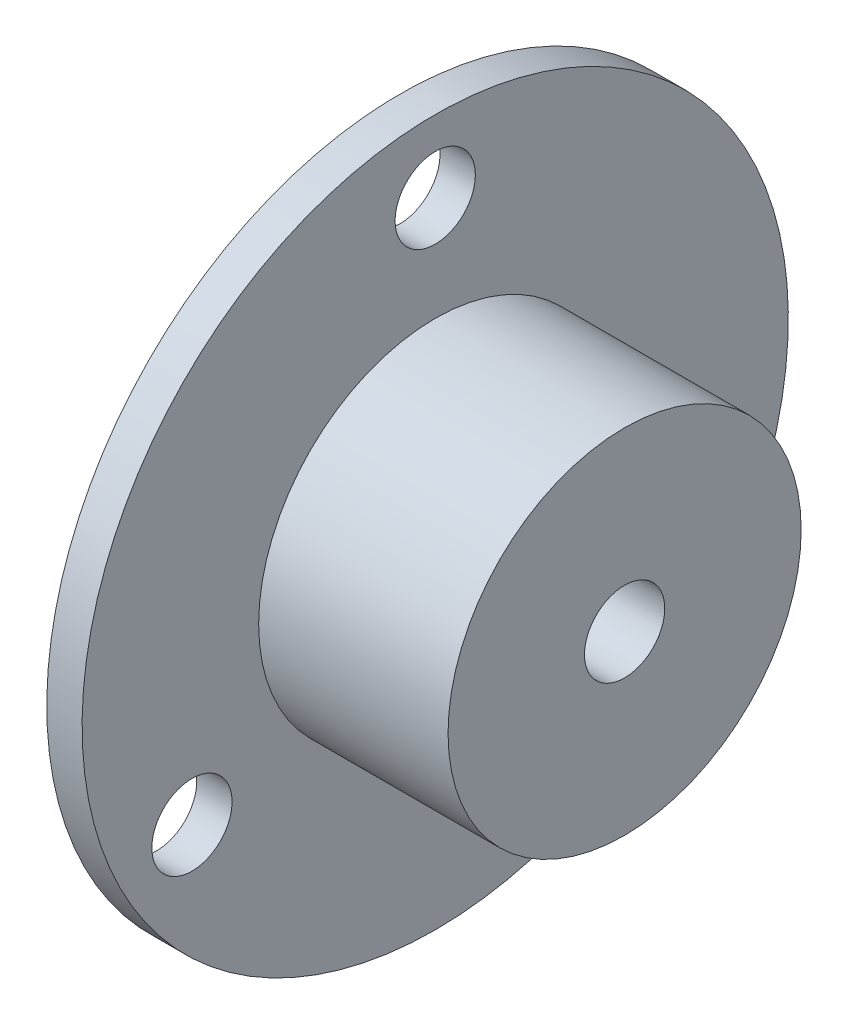
ISO-10303-21;
HEADER;
FILE_DESCRIPTION(('STEP AP214'),'2;1');
FILE_NAME('part.step','',(''),(''),'','','');
FILE_SCHEMA(('AUTOMOTIVE_DESIGN { 1 0 10303 214 1 1 1 1 }'));
ENDSEC;
DATA;
#1=APPLICATION_CONTEXT('core data for automotive mechanical design processes');
#2=APPLICATION_PROTOCOL_DEFINITION('international standard','automotive_design',2000,#1);
#3=PRODUCT_CONTEXT('',#1,'mechanical');
#4=PRODUCT('Part','Part','',(#3));
#5=PRODUCT_RELATED_PRODUCT_CATEGORY('part','',(#4));
#6=PRODUCT_DEFINITION_FORMATION('','',#4);
#7=PRODUCT_DEFINITION_CONTEXT('part definition',#1,'design');
#8=PRODUCT_DEFINITION('design','',#6,#7);
#9=PRODUCT_DEFINITION_SHAPE('','',#8);
#10=(LENGTH_UNIT() NAMED_UNIT(*) SI_UNIT(.MILLI.,.METRE.));
#11=(NAMED_UNIT(*) PLANE_ANGLE_UNIT() SI_UNIT($,.RADIAN.));
#12=(NAMED_UNIT(*) SI_UNIT($,.STERADIAN.) SOLID_ANGLE_UNIT());
#13=UNCERTAINTY_MEASURE_WITH_UNIT(LENGTH_MEASURE(1.E-05),#10,'distance_accuracy_value','');
#14=(GEOMETRIC_REPRESENTATION_CONTEXT(3) GLOBAL_UNCERTAINTY_ASSIGNED_CONTEXT((#13)) GLOBAL_UNIT_ASSIGNED_CONTEXT((#10,
#11,#12)) REPRESENTATION_CONTEXT('',''));
#15=CARTESIAN_POINT('',(0.,0.,0.));
#16=DIRECTION('',(0.,0.,1.));
#17=DIRECTION('',(1.,0.,0.));
#18=AXIS2_PLACEMENT_3D('',#15,#16,#17);
#19=CARTESIAN_POINT('',(-10.,-4.5,0.));
#20=DIRECTION('',(-1.,0.,0.));
#21=DIRECTION('',(0.,-1.,0.));
#22=AXIS2_PLACEMENT_3D('',#19,#20,#21);
#23=PLANE('',#22);
#24=CARTESIAN_POINT('',(-10.,0.,0.));
#25=DIRECTION('',(-1.,0.,0.));
#26=DIRECTION('',(0.,0.,1.));
#27=AXIS2_PLACEMENT_3D('',#24,#25,#26);
#28=CIRCLE('',#27,2.5);
#29=CARTESIAN_POINT('',(-10.,0.,2.5));
#30=VERTEX_POINT('',#29);
#31=EDGE_CURVE('E88',#30,#30,#28,.T.);
#32=ORIENTED_EDGE('',*,*,#31,.F.);
#33=EDGE_LOOP('',(#32));
#34=FACE_BOUND('',#33,.T.);
#35=CARTESIAN_POINT('',(-10.,0.,0.));
#36=DIRECTION('',(-1.,0.,0.));
#37=DIRECTION('',(0.,-1.,0.));
#38=AXIS2_PLACEMENT_3D('',#35,#36,#37);
#39=CIRCLE('',#38,4.5);
#40=CARTESIAN_POINT('',(-10.,-4.5,0.));
#41=VERTEX_POINT('',#40);
#42=EDGE_CURVE('E66',#41,#41,#39,.T.);
#43=ORIENTED_EDGE('',*,*,#42,.T.);
#44=EDGE_LOOP('',(#43));
#45=FACE_BOUND('',#44,.T.);
#46=ADVANCED_FACE('F38',(#34,#45),#23,.T.);
#47=CARTESIAN_POINT('',(14.,0.,0.));
#48=DIRECTION('',(1.,0.,0.));
#49=DIRECTION('',(0.,1.,0.));
#50=AXIS2_PLACEMENT_3D('',#47,#48,#49);
#51=PLANE('',#50);
#52=CARTESIAN_POINT('',(14.,0.,0.));
#53=DIRECTION('',(-1.,0.,0.));
#54=DIRECTION('',(0.,0.,1.));
#55=AXIS2_PLACEMENT_3D('',#52,#53,#54);
#56=CIRCLE('',#55,2.5);
#57=CARTESIAN_POINT('',(14.,0.,2.5));
#58=VERTEX_POINT('',#57);
#59=EDGE_CURVE('E83',#58,#58,#56,.T.);
#60=ORIENTED_EDGE('',*,*,#59,.T.);
#61=EDGE_LOOP('',(#60));
#62=FACE_BOUND('',#61,.T.);
#63=CARTESIAN_POINT('',(14.,0.,0.));
#64=DIRECTION('',(-1.,0.,0.));
#65=DIRECTION('',(0.,-1.,0.));
#66=AXIS2_PLACEMENT_3D('',#63,#64,#65);
#67=CIRCLE('',#66,11.);
#68=CARTESIAN_POINT('',(14.,-11.,0.));
#69=VERTEX_POINT('',#68);
#70=EDGE_CURVE('E10',#69,#69,#67,.T.);
#71=ORIENTED_EDGE('',*,*,#70,.F.);
#72=EDGE_LOOP('',(#71));
#73=FACE_BOUND('',#72,.T.);
#74=ADVANCED_FACE('F94',(#62,#73),#51,.T.);
#75=CARTESIAN_POINT('',(-10.,0.,0.));
#76=DIRECTION('',(-1.,0.,0.));
#77=DIRECTION('',(0.,-1.,0.));
#78=AXIS2_PLACEMENT_3D('',#75,#76,#77);
#79=CYLINDRICAL_SURFACE('',#78,11.);
#80=ORIENTED_EDGE('',*,*,#70,.T.);
#81=EDGE_LOOP('',(#80));
#82=FACE_BOUND('',#81,.T.);
#83=CARTESIAN_POINT('',(2.2,0.,0.));
#84=DIRECTION('',(-1.,0.,0.));
#85=DIRECTION('',(0.,-1.,0.));
#86=AXIS2_PLACEMENT_3D('',#83,#84,#85);
#87=CIRCLE('',#86,11.);
#88=CARTESIAN_POINT('',(2.2,-11.,0.));
#89=VERTEX_POINT('',#88);
#90=EDGE_CURVE('E44',#89,#89,#87,.T.);
#91=ORIENTED_EDGE('',*,*,#90,.F.);
#92=EDGE_LOOP('',(#91));
#93=FACE_BOUND('',#92,.T.);
#94=ADVANCED_FACE('F140',(#82,#93),#79,.T.);
#95=CARTESIAN_POINT('',(2.2,-11.,0.));
#96=DIRECTION('',(1.,0.,0.));
#97=DIRECTION('',(0.,1.,0.));
#98=AXIS2_PLACEMENT_3D('',#95,#96,#97);
#99=PLANE('',#98);
#100=CARTESIAN_POINT('',(2.2,17.5,0.));
#101=DIRECTION('',(1.,0.,0.));
#102=DIRECTION('',(0.,1.,0.));
#103=AXIS2_PLACEMENT_3D('',#100,#101,#102);
#104=CIRCLE('',#103,2.5);
#105=CARTESIAN_POINT('',(2.2,20.,0.));
#106=VERTEX_POINT('',#105);
#107=EDGE_CURVE('E69',#106,#106,#104,.T.);
#108=ORIENTED_EDGE('',*,*,#107,.F.);
#109=EDGE_LOOP('',(#108));
#110=FACE_BOUND('',#109,.T.);
#111=CARTESIAN_POINT('',(2.2,-8.74999999999936,15.1554445662288));
#112=DIRECTION('',(1.,0.,0.));
#113=DIRECTION('',(0.,1.,0.));
#114=AXIS2_PLACEMENT_3D('',#111,#112,#113);
#115=CIRCLE('',#114,2.50000000000096);
#116=CARTESIAN_POINT('',(2.2,-6.24999999999839,15.1554445662288));
#117=VERTEX_POINT('',#116);
#118=EDGE_CURVE('E72',#117,#117,#115,.T.);
#119=ORIENTED_EDGE('',*,*,#118,.F.);
#120=EDGE_LOOP('',(#119));
#121=FACE_BOUND('',#120,.T.);
#122=CARTESIAN_POINT('',(2.2,-8.75000000000064,-15.1554445662266));
#123=DIRECTION('',(1.,0.,0.));
#124=DIRECTION('',(0.,1.,0.));
#125=AXIS2_PLACEMENT_3D('',#122,#123,#124);
#126=CIRCLE('',#125,2.5000000000014);
#127=CARTESIAN_POINT('',(2.2,-6.24999999999924,-15.1554445662266));
#128=VERTEX_POINT('',#127);
#129=EDGE_CURVE('E75',#128,#128,#126,.T.);
#130=ORIENTED_EDGE('',*,*,#129,.F.);
#131=EDGE_LOOP('',(#130));
#132=FACE_BOUND('',#131,.T.);
#133=ORIENTED_EDGE('',*,*,#90,.T.);
#134=EDGE_LOOP('',(#133));
#135=FACE_BOUND('',#134,.T.);
#136=CARTESIAN_POINT('',(2.2,0.,0.));
#137=DIRECTION('',(-1.,0.,0.));
#138=DIRECTION('',(0.,-1.,0.));
#139=AXIS2_PLACEMENT_3D('',#136,#137,#138);
#140=CIRCLE('',#139,22.);
#141=CARTESIAN_POINT('',(2.2,-22.,0.));
#142=VERTEX_POINT('',#141);
#143=EDGE_CURVE('E48',#142,#142,#140,.T.);
#144=ORIENTED_EDGE('',*,*,#143,.F.);
#145=EDGE_LOOP('',(#144));
#146=FACE_BOUND('',#145,.T.);
#147=ADVANCED_FACE('F137',(#110,#121,#132,#135,#146),#99,.T.);
#148=CARTESIAN_POINT('',(-10.,0.,0.));
#149=DIRECTION('',(-1.,0.,0.));
#150=DIRECTION('',(0.,-1.,0.));
#151=AXIS2_PLACEMENT_3D('',#148,#149,#150);
#152=CYLINDRICAL_SURFACE('',#151,22.);
#153=ORIENTED_EDGE('',*,*,#143,.T.);
#154=EDGE_LOOP('',(#153));
#155=FACE_BOUND('',#154,.T.);
#156=CARTESIAN_POINT('',(0.,0.,0.));
#157=DIRECTION('',(-1.,0.,0.));
#158=DIRECTION('',(0.,-1.,0.));
#159=AXIS2_PLACEMENT_3D('',#156,#157,#158);
#160=CIRCLE('',#159,22.);
#161=CARTESIAN_POINT('',(0.,-22.,0.));
#162=VERTEX_POINT('',#161);
#163=EDGE_CURVE('E52',#162,#162,#160,.T.);
#164=ORIENTED_EDGE('',*,*,#163,.F.);
#165=EDGE_LOOP('',(#164));
#166=FACE_BOUND('',#165,.T.);
#167=ADVANCED_FACE('F133',(#155,#166),#152,.T.);
#168=CARTESIAN_POINT('',(0.,-22.,0.));
#169=DIRECTION('',(-1.,0.,0.));
#170=DIRECTION('',(0.,-1.,0.));
#171=AXIS2_PLACEMENT_3D('',#168,#169,#170);
#172=PLANE('',#171);
#173=CARTESIAN_POINT('',(0.,17.5,0.));
#174=DIRECTION('',(-1.,0.,0.));
#175=DIRECTION('',(0.,0.,1.));
#176=AXIS2_PLACEMENT_3D('',#173,#174,#175);
#177=CIRCLE('',#176,2.5);
#178=CARTESIAN_POINT('',(0.,17.5,2.5));
#179=VERTEX_POINT('',#178);
#180=EDGE_CURVE('E78',#179,#179,#177,.T.);
#181=ORIENTED_EDGE('',*,*,#180,.F.);
#182=EDGE_LOOP('',(#181));
#183=FACE_BOUND('',#182,.T.);
#184=CARTESIAN_POINT('',(0.,-8.74999999999936,15.1554445662288));
#185=DIRECTION('',(-1.,0.,0.));
#186=DIRECTION('',(0.,0.,1.));
#187=AXIS2_PLACEMENT_3D('',#184,#185,#186);
#188=CIRCLE('',#187,2.50000000000096);
#189=CARTESIAN_POINT('',(0.,-8.74999999999936,17.6554445662298));
#190=VERTEX_POINT('',#189);
#191=EDGE_CURVE('E82',#190,#190,#188,.T.);
#192=ORIENTED_EDGE('',*,*,#191,.F.);
#193=EDGE_LOOP('',(#192));
#194=FACE_BOUND('',#193,.T.);
#195=CARTESIAN_POINT('',(0.,-8.75000000000064,-15.1554445662266));
#196=DIRECTION('',(-1.,0.,0.));
#197=DIRECTION('',(0.,0.,1.));
#198=AXIS2_PLACEMENT_3D('',#195,#196,#197);
#199=CIRCLE('',#198,2.5000000000014);
#200=CARTESIAN_POINT('',(0.,-8.75000000000064,-12.6554445662252));
#201=VERTEX_POINT('',#200);
#202=EDGE_CURVE('E79',#201,#201,#199,.T.);
#203=ORIENTED_EDGE('',*,*,#202,.F.);
#204=EDGE_LOOP('',(#203));
#205=FACE_BOUND('',#204,.T.);
#206=ORIENTED_EDGE('',*,*,#163,.T.);
#207=EDGE_LOOP('',(#206));
#208=FACE_BOUND('',#207,.T.);
#209=CARTESIAN_POINT('',(0.,0.,0.));
#210=DIRECTION('',(-1.,0.,0.));
#211=DIRECTION('',(0.,-1.,0.));
#212=AXIS2_PLACEMENT_3D('',#209,#210,#211);
#213=CIRCLE('',#212,11.);
#214=CARTESIAN_POINT('',(0.,-11.,0.));
#215=VERTEX_POINT('',#214);
#216=EDGE_CURVE('E57',#215,#215,#213,.T.);
#217=ORIENTED_EDGE('',*,*,#216,.F.);
#218=EDGE_LOOP('',(#217));
#219=FACE_BOUND('',#218,.T.);
#220=ADVANCED_FACE('F129',(#183,#194,#205,#208,#219),#172,.T.);
#221=CARTESIAN_POINT('',(-10.,0.,0.));
#222=DIRECTION('',(-1.,0.,0.));
#223=DIRECTION('',(0.,-1.,0.));
#224=AXIS2_PLACEMENT_3D('',#221,#222,#223);
#225=CYLINDRICAL_SURFACE('',#224,11.);
#226=ORIENTED_EDGE('',*,*,#216,.T.);
#227=EDGE_LOOP('',(#226));
#228=FACE_BOUND('',#227,.T.);
#229=CARTESIAN_POINT('',(-5.,0.,0.));
#230=DIRECTION('',(-1.,0.,0.));
#231=DIRECTION('',(0.,-1.,0.));
#232=AXIS2_PLACEMENT_3D('',#229,#230,#231);
#233=CIRCLE('',#232,11.);
#234=CARTESIAN_POINT('',(-5.,-11.,0.));
#235=VERTEX_POINT('',#234);
#236=EDGE_CURVE('E60',#235,#235,#233,.T.);
#237=ORIENTED_EDGE('',*,*,#236,.F.);
#238=EDGE_LOOP('',(#237));
#239=FACE_BOUND('',#238,.T.);
#240=ADVANCED_FACE('F122',(#228,#239),#225,.T.);
#241=CARTESIAN_POINT('',(-5.,-11.,0.));
#242=DIRECTION('',(-1.,0.,0.));
#243=DIRECTION('',(0.,-1.,0.));
#244=AXIS2_PLACEMENT_3D('',#241,#242,#243);
#245=PLANE('',#244);
#246=ORIENTED_EDGE('',*,*,#236,.T.);
#247=EDGE_LOOP('',(#246));
#248=FACE_BOUND('',#247,.T.);
#249=CARTESIAN_POINT('',(-5.,0.,0.));
#250=DIRECTION('',(-1.,0.,0.));
#251=DIRECTION('',(0.,-1.,0.));
#252=AXIS2_PLACEMENT_3D('',#249,#250,#251);
#253=CIRCLE('',#252,4.5);
#254=CARTESIAN_POINT('',(-5.,-4.5,0.));
#255=VERTEX_POINT('',#254);
#256=EDGE_CURVE('E63',#255,#255,#253,.T.);
#257=ORIENTED_EDGE('',*,*,#256,.F.);
#258=EDGE_LOOP('',(#257));
#259=FACE_BOUND('',#258,.T.);
#260=ADVANCED_FACE('F111',(#248,#259),#245,.T.);
#261=CARTESIAN_POINT('',(-10.,0.,0.));
#262=DIRECTION('',(-1.,0.,0.));
#263=DIRECTION('',(0.,-1.,0.));
#264=AXIS2_PLACEMENT_3D('',#261,#262,#263);
#265=CYLINDRICAL_SURFACE('',#264,4.5);
#266=ORIENTED_EDGE('',*,*,#256,.T.);
#267=EDGE_LOOP('',(#266));
#268=FACE_BOUND('',#267,.T.);
#269=ORIENTED_EDGE('',*,*,#42,.F.);
#270=EDGE_LOOP('',(#269));
#271=FACE_BOUND('',#270,.T.);
#272=ADVANCED_FACE('F108',(#268,#271),#265,.T.);
#273=CARTESIAN_POINT('',(10.,-8.75000000000064,-15.1554445662266));
#274=DIRECTION('',(-1.,0.,0.));
#275=DIRECTION('',(0.,0.,1.));
#276=AXIS2_PLACEMENT_3D('',#273,#274,#275);
#277=CYLINDRICAL_SURFACE('',#276,2.5000000000014);
#278=ORIENTED_EDGE('',*,*,#129,.T.);
#279=EDGE_LOOP('',(#278));
#280=FACE_BOUND('',#279,.T.);
#281=ORIENTED_EDGE('',*,*,#202,.T.);
#282=EDGE_LOOP('',(#281));
#283=FACE_BOUND('',#282,.T.);
#284=ADVANCED_FACE('F110',(#280,#283),#277,.F.);
#285=CARTESIAN_POINT('',(10.,-8.74999999999936,15.1554445662288));
#286=DIRECTION('',(-1.,0.,0.));
#287=DIRECTION('',(0.,0.,1.));
#288=AXIS2_PLACEMENT_3D('',#285,#286,#287);
#289=CYLINDRICAL_SURFACE('',#288,2.50000000000096);
#290=ORIENTED_EDGE('',*,*,#118,.T.);
#291=EDGE_LOOP('',(#290));
#292=FACE_BOUND('',#291,.T.);
#293=ORIENTED_EDGE('',*,*,#191,.T.);
#294=EDGE_LOOP('',(#293));
#295=FACE_BOUND('',#294,.T.);
#296=ADVANCED_FACE('F119',(#292,#295),#289,.F.);
#297=CARTESIAN_POINT('',(10.,17.5,0.));
#298=DIRECTION('',(-1.,0.,0.));
#299=DIRECTION('',(0.,0.,1.));
#300=AXIS2_PLACEMENT_3D('',#297,#298,#299);
#301=CYLINDRICAL_SURFACE('',#300,2.5);
#302=ORIENTED_EDGE('',*,*,#107,.T.);
#303=EDGE_LOOP('',(#302));
#304=FACE_BOUND('',#303,.T.);
#305=ORIENTED_EDGE('',*,*,#180,.T.);
#306=EDGE_LOOP('',(#305));
#307=FACE_BOUND('',#306,.T.);
#308=ADVANCED_FACE('F100',(#304,#307),#301,.F.);
#309=CARTESIAN_POINT('',(14.,0.,0.));
#310=DIRECTION('',(-1.,0.,0.));
#311=DIRECTION('',(0.,0.,1.));
#312=AXIS2_PLACEMENT_3D('',#309,#310,#311);
#313=CYLINDRICAL_SURFACE('',#312,2.5);
#314=ORIENTED_EDGE('',*,*,#59,.F.);
#315=EDGE_LOOP('',(#314));
#316=FACE_BOUND('',#315,.T.);
#317=ORIENTED_EDGE('',*,*,#31,.T.);
#318=EDGE_LOOP('',(#317));
#319=FACE_BOUND('',#318,.T.);
#320=ADVANCED_FACE('F97',(#316,#319),#313,.F.);
#321=CLOSED_SHELL('',(#46,#74,#94,#147,#167,#220,#240,#260,#272,#284,#296,#308,#320));
#322=MANIFOLD_SOLID_BREP('B2',#321);
#323=ADVANCED_BREP_SHAPE_REPRESENTATION('',(#18,#322),#14);
#324=SHAPE_DEFINITION_REPRESENTATION(#9,#323);
ENDSEC;
END-ISO-10303-21;
